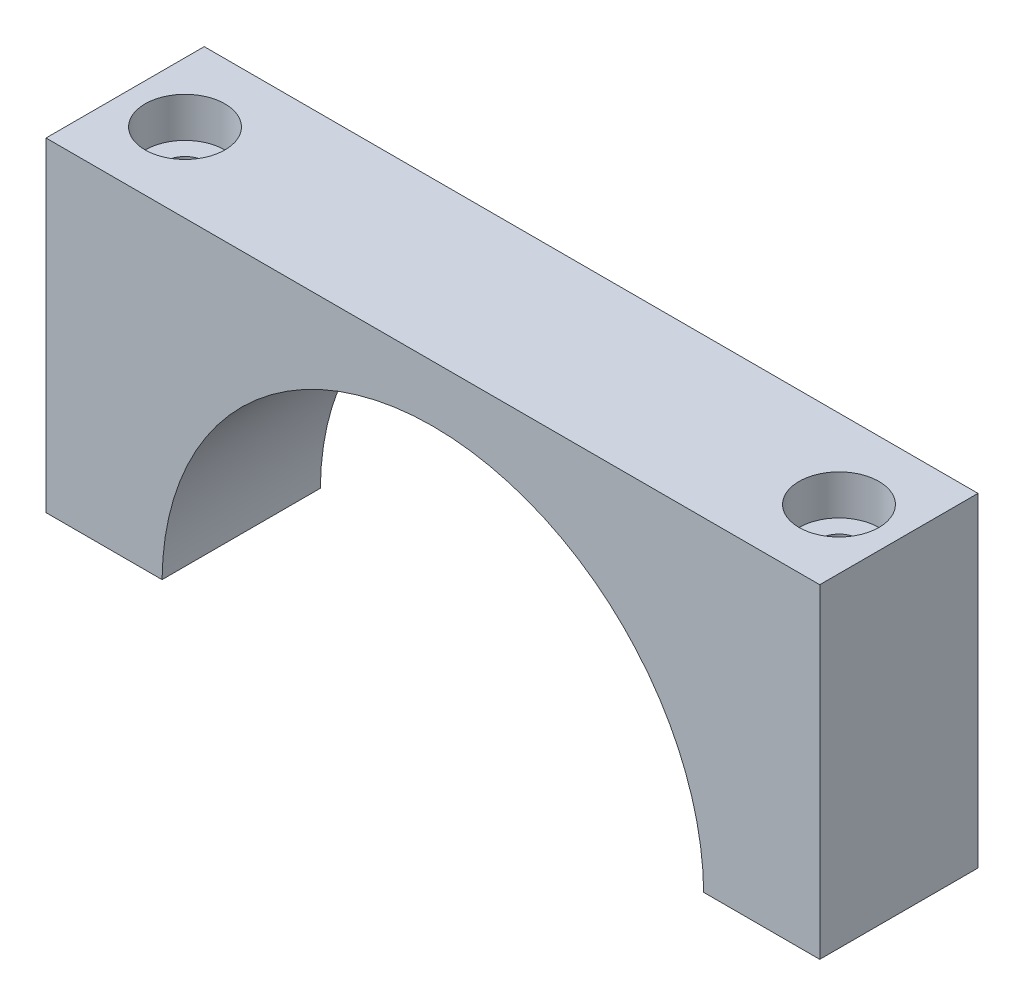
ISO-10303-21;
HEADER;
FILE_DESCRIPTION(('STEP AP214'),'2;1');
FILE_NAME('part.step','',(''),(''),'','','');
FILE_SCHEMA(('AUTOMOTIVE_DESIGN { 1 0 10303 214 1 1 1 1 }'));
ENDSEC;
DATA;
#1=APPLICATION_CONTEXT('core data for automotive mechanical design processes');
#2=APPLICATION_PROTOCOL_DEFINITION('international standard','automotive_design',2000,#1);
#3=PRODUCT_CONTEXT('',#1,'mechanical');
#4=PRODUCT('Part','Part','',(#3));
#5=PRODUCT_RELATED_PRODUCT_CATEGORY('part','',(#4));
#6=PRODUCT_DEFINITION_FORMATION('','',#4);
#7=PRODUCT_DEFINITION_CONTEXT('part definition',#1,'design');
#8=PRODUCT_DEFINITION('design','',#6,#7);
#9=PRODUCT_DEFINITION_SHAPE('','',#8);
#10=(LENGTH_UNIT() NAMED_UNIT(*) SI_UNIT(.MILLI.,.METRE.));
#11=(NAMED_UNIT(*) PLANE_ANGLE_UNIT() SI_UNIT($,.RADIAN.));
#12=(NAMED_UNIT(*) SI_UNIT($,.STERADIAN.) SOLID_ANGLE_UNIT());
#13=UNCERTAINTY_MEASURE_WITH_UNIT(LENGTH_MEASURE(1.E-05),#10,'distance_accuracy_value','');
#14=(GEOMETRIC_REPRESENTATION_CONTEXT(3) GLOBAL_UNCERTAINTY_ASSIGNED_CONTEXT((#13)) GLOBAL_UNIT_ASSIGNED_CONTEXT((#10,
#11,#12)) REPRESENTATION_CONTEXT('',''));
#15=CARTESIAN_POINT('',(0.,0.,0.));
#16=DIRECTION('',(0.,0.,1.));
#17=DIRECTION('',(1.,0.,0.));
#18=AXIS2_PLACEMENT_3D('',#15,#16,#17);
#19=CARTESIAN_POINT('',(0.,41.1711599490778,0.));
#20=DIRECTION('',(0.,0.,1.));
#21=DIRECTION('',(1.,0.,0.));
#22=AXIS2_PLACEMENT_3D('',#19,#20,#21);
#23=PLANE('',#22);
#24=CARTESIAN_POINT('',(0.,0.,0.));
#25=DIRECTION('',(0.,0.,-1.));
#26=DIRECTION('',(-0.999957526333654,-0.0092165898617512,0.));
#27=AXIS2_PLACEMENT_3D('',#24,#25,#26);
#28=CIRCLE('',#27,54.25);
#29=CARTESIAN_POINT('',(-54.2476958036007,0.5,0.));
#30=VERTEX_POINT('',#29);
#31=CARTESIAN_POINT('',(54.2476958036007,0.5,0.));
#32=VERTEX_POINT('',#31);
#33=EDGE_CURVE('E28',#30,#32,#28,.T.);
#34=ORIENTED_EDGE('',*,*,#33,.F.);
#35=DIRECTION('',(1.,0.,0.));
#36=VECTOR('',#35,1.);
#37=CARTESIAN_POINT('',(-77.5,0.5,0.));
#38=LINE('',#37,#36);
#39=CARTESIAN_POINT('',(-77.5,0.5,0.));
#40=VERTEX_POINT('',#39);
#41=EDGE_CURVE('E165',#40,#30,#38,.T.);
#42=ORIENTED_EDGE('',*,*,#41,.F.);
#43=DIRECTION('',(0.,-1.,0.));
#44=VECTOR('',#43,1.);
#45=CARTESIAN_POINT('',(-77.5,65.5,0.));
#46=LINE('',#45,#44);
#47=CARTESIAN_POINT('',(-77.5,65.5,0.));
#48=VERTEX_POINT('',#47);
#49=EDGE_CURVE('E170',#48,#40,#46,.T.);
#50=ORIENTED_EDGE('',*,*,#49,.F.);
#51=DIRECTION('',(-1.,0.,0.));
#52=VECTOR('',#51,1.);
#53=CARTESIAN_POINT('',(77.5,65.5,0.));
#54=LINE('',#53,#52);
#55=CARTESIAN_POINT('',(77.5,65.5,0.));
#56=VERTEX_POINT('',#55);
#57=EDGE_CURVE('E116',#56,#48,#54,.T.);
#58=ORIENTED_EDGE('',*,*,#57,.F.);
#59=DIRECTION('',(0.,1.,0.));
#60=VECTOR('',#59,1.);
#61=CARTESIAN_POINT('',(77.5,0.5,0.));
#62=LINE('',#61,#60);
#63=CARTESIAN_POINT('',(77.5,0.5,0.));
#64=VERTEX_POINT('',#63);
#65=EDGE_CURVE('E108',#64,#56,#62,.T.);
#66=ORIENTED_EDGE('',*,*,#65,.F.);
#67=DIRECTION('',(1.,0.,0.));
#68=VECTOR('',#67,1.);
#69=CARTESIAN_POINT('',(54.2476958036007,0.5,0.));
#70=LINE('',#69,#68);
#71=EDGE_CURVE('E92',#32,#64,#70,.T.);
#72=ORIENTED_EDGE('',*,*,#71,.F.);
#73=EDGE_LOOP('',(#34,#42,#50,#58,#66,#72));
#74=FACE_BOUND('',#73,.T.);
#75=ADVANCED_FACE('F17',(#74),#23,.F.);
#76=CARTESIAN_POINT('',(0.,41.1711599490778,31.7));
#77=DIRECTION('',(0.,0.,1.));
#78=DIRECTION('',(1.,0.,0.));
#79=AXIS2_PLACEMENT_3D('',#76,#77,#78);
#80=PLANE('',#79);
#81=CARTESIAN_POINT('',(0.,0.,31.7));
#82=DIRECTION('',(0.,0.,-1.));
#83=DIRECTION('',(-0.999957526333654,-0.0092165898617512,0.));
#84=AXIS2_PLACEMENT_3D('',#81,#82,#83);
#85=CIRCLE('',#84,54.25);
#86=CARTESIAN_POINT('',(-54.2476958036007,0.5,31.7));
#87=VERTEX_POINT('',#86);
#88=CARTESIAN_POINT('',(54.2476958036007,0.5,31.7));
#89=VERTEX_POINT('',#88);
#90=EDGE_CURVE('E11',#87,#89,#85,.T.);
#91=ORIENTED_EDGE('',*,*,#90,.T.);
#92=DIRECTION('',(1.,0.,0.));
#93=VECTOR('',#92,1.);
#94=CARTESIAN_POINT('',(54.2476958036007,0.5,31.7));
#95=LINE('',#94,#93);
#96=CARTESIAN_POINT('',(77.5,0.5,31.7));
#97=VERTEX_POINT('',#96);
#98=EDGE_CURVE('E102',#89,#97,#95,.T.);
#99=ORIENTED_EDGE('',*,*,#98,.T.);
#100=DIRECTION('',(0.,1.,0.));
#101=VECTOR('',#100,1.);
#102=CARTESIAN_POINT('',(77.5,0.5,31.7));
#103=LINE('',#102,#101);
#104=CARTESIAN_POINT('',(77.5,65.5,31.7));
#105=VERTEX_POINT('',#104);
#106=EDGE_CURVE('E110',#97,#105,#103,.T.);
#107=ORIENTED_EDGE('',*,*,#106,.T.);
#108=DIRECTION('',(-1.,0.,0.));
#109=VECTOR('',#108,1.);
#110=CARTESIAN_POINT('',(77.5,65.5,31.7));
#111=LINE('',#110,#109);
#112=CARTESIAN_POINT('',(-77.5,65.5,31.7));
#113=VERTEX_POINT('',#112);
#114=EDGE_CURVE('E126',#105,#113,#111,.T.);
#115=ORIENTED_EDGE('',*,*,#114,.T.);
#116=DIRECTION('',(0.,-1.,0.));
#117=VECTOR('',#116,1.);
#118=CARTESIAN_POINT('',(-77.5,65.5,31.7));
#119=LINE('',#118,#117);
#120=CARTESIAN_POINT('',(-77.5,0.5,31.7));
#121=VERTEX_POINT('',#120);
#122=EDGE_CURVE('E166',#113,#121,#119,.T.);
#123=ORIENTED_EDGE('',*,*,#122,.T.);
#124=DIRECTION('',(1.,0.,0.));
#125=VECTOR('',#124,1.);
#126=CARTESIAN_POINT('',(-77.5,0.5,31.7));
#127=LINE('',#126,#125);
#128=EDGE_CURVE('E129',#121,#87,#127,.T.);
#129=ORIENTED_EDGE('',*,*,#128,.T.);
#130=EDGE_LOOP('',(#91,#99,#107,#115,#123,#129));
#131=FACE_BOUND('',#130,.T.);
#132=ADVANCED_FACE('F237',(#131),#80,.T.);
#133=CARTESIAN_POINT('',(0.,0.,0.));
#134=DIRECTION('',(0.,0.,1.));
#135=DIRECTION('',(-0.999957526333654,-0.0092165898617512,0.));
#136=AXIS2_PLACEMENT_3D('',#133,#134,#135);
#137=CYLINDRICAL_SURFACE('',#136,54.25);
#138=ORIENTED_EDGE('',*,*,#33,.T.);
#139=DIRECTION('',(0.,0.,1.));
#140=VECTOR('',#139,1.);
#141=CARTESIAN_POINT('',(54.2476958036007,0.5,0.));
#142=LINE('',#141,#140);
#143=EDGE_CURVE('E98',#32,#89,#142,.T.);
#144=ORIENTED_EDGE('',*,*,#143,.T.);
#145=ORIENTED_EDGE('',*,*,#90,.F.);
#146=DIRECTION('',(0.,0.,1.));
#147=VECTOR('',#146,1.);
#148=CARTESIAN_POINT('',(-54.2476958036007,0.5,0.));
#149=LINE('',#148,#147);
#150=EDGE_CURVE('E161',#30,#87,#149,.T.);
#151=ORIENTED_EDGE('',*,*,#150,.F.);
#152=EDGE_LOOP('',(#138,#144,#145,#151));
#153=FACE_BOUND('',#152,.T.);
#154=ADVANCED_FACE('F204',(#153),#137,.F.);
#155=CARTESIAN_POINT('',(54.2476958036007,0.5,0.));
#156=DIRECTION('',(0.,-1.,0.));
#157=DIRECTION('',(-1.,0.,0.));
#158=AXIS2_PLACEMENT_3D('',#155,#156,#157);
#159=PLANE('',#158);
#160=CARTESIAN_POINT('',(65.5,0.500000000000007,15.85));
#161=DIRECTION('',(0.,1.,0.));
#162=DIRECTION('',(-1.,0.,0.));
#163=AXIS2_PLACEMENT_3D('',#160,#161,#162);
#164=CIRCLE('',#163,4.05);
#165=CARTESIAN_POINT('',(69.55,0.500000000000007,15.85));
#166=VERTEX_POINT('',#165);
#167=EDGE_CURVE('E21',#166,#166,#164,.T.);
#168=ORIENTED_EDGE('',*,*,#167,.T.);
#169=EDGE_LOOP('',(#168));
#170=FACE_BOUND('',#169,.T.);
#171=ORIENTED_EDGE('',*,*,#71,.T.);
#172=DIRECTION('',(0.,0.,1.));
#173=VECTOR('',#172,1.);
#174=CARTESIAN_POINT('',(77.5,0.5,0.));
#175=LINE('',#174,#173);
#176=EDGE_CURVE('E96',#64,#97,#175,.T.);
#177=ORIENTED_EDGE('',*,*,#176,.T.);
#178=ORIENTED_EDGE('',*,*,#98,.F.);
#179=ORIENTED_EDGE('',*,*,#143,.F.);
#180=EDGE_LOOP('',(#171,#177,#178,#179));
#181=FACE_BOUND('',#180,.T.);
#182=ADVANCED_FACE('F94',(#170,#181),#159,.T.);
#183=CARTESIAN_POINT('',(77.5,0.5,0.));
#184=DIRECTION('',(1.,0.,0.));
#185=DIRECTION('',(0.,-1.,0.));
#186=AXIS2_PLACEMENT_3D('',#183,#184,#185);
#187=PLANE('',#186);
#188=ORIENTED_EDGE('',*,*,#65,.T.);
#189=DIRECTION('',(0.,0.,1.));
#190=VECTOR('',#189,1.);
#191=CARTESIAN_POINT('',(77.5,65.5,0.));
#192=LINE('',#191,#190);
#193=EDGE_CURVE('E118',#56,#105,#192,.T.);
#194=ORIENTED_EDGE('',*,*,#193,.T.);
#195=ORIENTED_EDGE('',*,*,#106,.F.);
#196=ORIENTED_EDGE('',*,*,#176,.F.);
#197=EDGE_LOOP('',(#188,#194,#195,#196));
#198=FACE_BOUND('',#197,.T.);
#199=ADVANCED_FACE('F106',(#198),#187,.T.);
#200=CARTESIAN_POINT('',(77.5,65.5,0.));
#201=DIRECTION('',(0.,1.,0.));
#202=DIRECTION('',(1.,0.,0.));
#203=AXIS2_PLACEMENT_3D('',#200,#201,#202);
#204=PLANE('',#203);
#205=CARTESIAN_POINT('',(-65.5,65.5,15.85));
#206=DIRECTION('',(0.,-1.,0.));
#207=DIRECTION('',(1.,0.,0.));
#208=AXIS2_PLACEMENT_3D('',#205,#206,#207);
#209=CIRCLE('',#208,8.);
#210=CARTESIAN_POINT('',(-73.5,65.5,15.85));
#211=VERTEX_POINT('',#210);
#212=EDGE_CURVE('E144',#211,#211,#209,.T.);
#213=ORIENTED_EDGE('',*,*,#212,.T.);
#214=EDGE_LOOP('',(#213));
#215=FACE_BOUND('',#214,.T.);
#216=CARTESIAN_POINT('',(65.5,65.5,15.85));
#217=DIRECTION('',(0.,-1.,0.));
#218=DIRECTION('',(-1.,0.,0.));
#219=AXIS2_PLACEMENT_3D('',#216,#217,#218);
#220=CIRCLE('',#219,8.);
#221=CARTESIAN_POINT('',(73.5,65.5,15.85));
#222=VERTEX_POINT('',#221);
#223=EDGE_CURVE('E152',#222,#222,#220,.T.);
#224=ORIENTED_EDGE('',*,*,#223,.T.);
#225=EDGE_LOOP('',(#224));
#226=FACE_BOUND('',#225,.T.);
#227=ORIENTED_EDGE('',*,*,#57,.T.);
#228=DIRECTION('',(0.,0.,1.));
#229=VECTOR('',#228,1.);
#230=CARTESIAN_POINT('',(-77.5,65.5,0.));
#231=LINE('',#230,#229);
#232=EDGE_CURVE('E169',#48,#113,#231,.T.);
#233=ORIENTED_EDGE('',*,*,#232,.T.);
#234=ORIENTED_EDGE('',*,*,#114,.F.);
#235=ORIENTED_EDGE('',*,*,#193,.F.);
#236=EDGE_LOOP('',(#227,#233,#234,#235));
#237=FACE_BOUND('',#236,.T.);
#238=ADVANCED_FACE('F19',(#215,#226,#237),#204,.T.);
#239=CARTESIAN_POINT('',(-77.5,65.5,0.));
#240=DIRECTION('',(-1.,0.,0.));
#241=DIRECTION('',(0.,1.,0.));
#242=AXIS2_PLACEMENT_3D('',#239,#240,#241);
#243=PLANE('',#242);
#244=ORIENTED_EDGE('',*,*,#49,.T.);
#245=DIRECTION('',(0.,0.,1.));
#246=VECTOR('',#245,1.);
#247=CARTESIAN_POINT('',(-77.5,0.5,0.));
#248=LINE('',#247,#246);
#249=EDGE_CURVE('E181',#40,#121,#248,.T.);
#250=ORIENTED_EDGE('',*,*,#249,.T.);
#251=ORIENTED_EDGE('',*,*,#122,.F.);
#252=ORIENTED_EDGE('',*,*,#232,.F.);
#253=EDGE_LOOP('',(#244,#250,#251,#252));
#254=FACE_BOUND('',#253,.T.);
#255=ADVANCED_FACE('F212',(#254),#243,.T.);
#256=CARTESIAN_POINT('',(-77.5,0.5,0.));
#257=DIRECTION('',(0.,-1.,0.));
#258=DIRECTION('',(0.,0.,-1.));
#259=AXIS2_PLACEMENT_3D('',#256,#257,#258);
#260=PLANE('',#259);
#261=CARTESIAN_POINT('',(-65.5,0.500000000000007,15.85));
#262=DIRECTION('',(0.,1.,0.));
#263=DIRECTION('',(1.,0.,0.));
#264=AXIS2_PLACEMENT_3D('',#261,#262,#263);
#265=CIRCLE('',#264,4.05);
#266=CARTESIAN_POINT('',(-69.55,0.500000000000007,15.85));
#267=VERTEX_POINT('',#266);
#268=EDGE_CURVE('E160',#267,#267,#265,.T.);
#269=ORIENTED_EDGE('',*,*,#268,.T.);
#270=EDGE_LOOP('',(#269));
#271=FACE_BOUND('',#270,.T.);
#272=ORIENTED_EDGE('',*,*,#41,.T.);
#273=ORIENTED_EDGE('',*,*,#150,.T.);
#274=ORIENTED_EDGE('',*,*,#128,.F.);
#275=ORIENTED_EDGE('',*,*,#249,.F.);
#276=EDGE_LOOP('',(#272,#273,#274,#275));
#277=FACE_BOUND('',#276,.T.);
#278=ADVANCED_FACE('F208',(#271,#277),#260,.T.);
#279=CARTESIAN_POINT('',(-65.5,-105.540609213134,15.85));
#280=DIRECTION('',(0.,1.,0.));
#281=DIRECTION('',(1.,0.,0.));
#282=AXIS2_PLACEMENT_3D('',#279,#280,#281);
#283=CYLINDRICAL_SURFACE('',#282,4.05);
#284=CARTESIAN_POINT('',(-65.5,57.5,15.85));
#285=DIRECTION('',(0.,1.,0.));
#286=DIRECTION('',(1.,0.,0.));
#287=AXIS2_PLACEMENT_3D('',#284,#285,#286);
#288=CIRCLE('',#287,4.05);
#289=CARTESIAN_POINT('',(-69.55,57.5,15.85));
#290=VERTEX_POINT('',#289);
#291=EDGE_CURVE('E137',#290,#290,#288,.T.);
#292=ORIENTED_EDGE('',*,*,#291,.T.);
#293=DIRECTION('',(0.,-1.,0.));
#294=VECTOR('',#293,1.);
#295=CARTESIAN_POINT('',(-69.55,-105.540609213134,15.85));
#296=LINE('',#295,#294);
#297=EDGE_CURVE('E143',#290,#267,#296,.T.);
#298=ORIENTED_EDGE('',*,*,#297,.T.);
#299=ORIENTED_EDGE('',*,*,#268,.F.);
#300=ORIENTED_EDGE('',*,*,#297,.F.);
#301=EDGE_LOOP('',(#292,#298,#299,#300));
#302=FACE_BOUND('',#301,.T.);
#303=ADVANCED_FACE('F368',(#302),#283,.F.);
#304=CARTESIAN_POINT('',(-65.5,61.5,15.85));
#305=DIRECTION('',(0.,1.,0.));
#306=DIRECTION('',(1.,0.,0.));
#307=AXIS2_PLACEMENT_3D('',#304,#305,#306);
#308=CYLINDRICAL_SURFACE('',#307,8.);
#309=ORIENTED_EDGE('',*,*,#212,.F.);
#310=DIRECTION('',(0.,-1.,0.));
#311=VECTOR('',#310,1.);
#312=CARTESIAN_POINT('',(-73.5,61.5,15.85));
#313=LINE('',#312,#311);
#314=CARTESIAN_POINT('',(-73.5,57.5,15.85));
#315=VERTEX_POINT('',#314);
#316=EDGE_CURVE('E139',#211,#315,#313,.T.);
#317=ORIENTED_EDGE('',*,*,#316,.T.);
#318=CARTESIAN_POINT('',(-65.5,57.5,15.85));
#319=DIRECTION('',(0.,1.,0.));
#320=DIRECTION('',(1.,0.,0.));
#321=AXIS2_PLACEMENT_3D('',#318,#319,#320);
#322=CIRCLE('',#321,8.);
#323=EDGE_CURVE('E134',#315,#315,#322,.T.);
#324=ORIENTED_EDGE('',*,*,#323,.F.);
#325=ORIENTED_EDGE('',*,*,#316,.F.);
#326=EDGE_LOOP('',(#309,#317,#324,#325));
#327=FACE_BOUND('',#326,.T.);
#328=ADVANCED_FACE('F360',(#327),#308,.F.);
#329=CARTESIAN_POINT('',(-65.5,57.5,15.85));
#330=DIRECTION('',(0.,1.,0.));
#331=DIRECTION('',(1.,0.,0.));
#332=AXIS2_PLACEMENT_3D('',#329,#330,#331);
#333=PLANE('',#332);
#334=ORIENTED_EDGE('',*,*,#291,.F.);
#335=EDGE_LOOP('',(#334));
#336=FACE_BOUND('',#335,.T.);
#337=ORIENTED_EDGE('',*,*,#323,.T.);
#338=EDGE_LOOP('',(#337));
#339=FACE_BOUND('',#338,.T.);
#340=ADVANCED_FACE('F358',(#336,#339),#333,.T.);
#341=CARTESIAN_POINT('',(65.5,-105.540609213134,15.85));
#342=DIRECTION('',(0.,-1.,0.));
#343=DIRECTION('',(-1.,0.,0.));
#344=AXIS2_PLACEMENT_3D('',#341,#342,#343);
#345=CYLINDRICAL_SURFACE('',#344,4.05);
#346=CARTESIAN_POINT('',(65.5,57.5,15.85));
#347=DIRECTION('',(0.,-1.,0.));
#348=DIRECTION('',(-1.,0.,0.));
#349=AXIS2_PLACEMENT_3D('',#346,#347,#348);
#350=CIRCLE('',#349,4.05);
#351=CARTESIAN_POINT('',(69.55,57.5,15.85));
#352=VERTEX_POINT('',#351);
#353=EDGE_CURVE('E156',#352,#352,#350,.T.);
#354=ORIENTED_EDGE('',*,*,#353,.F.);
#355=DIRECTION('',(0.,-1.,0.));
#356=VECTOR('',#355,1.);
#357=CARTESIAN_POINT('',(69.55,-105.540609213134,15.85));
#358=LINE('',#357,#356);
#359=EDGE_CURVE('E147',#352,#166,#358,.T.);
#360=ORIENTED_EDGE('',*,*,#359,.T.);
#361=ORIENTED_EDGE('',*,*,#167,.F.);
#362=ORIENTED_EDGE('',*,*,#359,.F.);
#363=EDGE_LOOP('',(#354,#360,#361,#362));
#364=FACE_BOUND('',#363,.T.);
#365=ADVANCED_FACE('F357',(#364),#345,.F.);
#366=CARTESIAN_POINT('',(65.5,61.5,15.85));
#367=DIRECTION('',(0.,-1.,0.));
#368=DIRECTION('',(-1.,0.,0.));
#369=AXIS2_PLACEMENT_3D('',#366,#367,#368);
#370=CYLINDRICAL_SURFACE('',#369,8.);
#371=ORIENTED_EDGE('',*,*,#223,.F.);
#372=DIRECTION('',(0.,-1.,0.));
#373=VECTOR('',#372,1.);
#374=CARTESIAN_POINT('',(73.5,61.5,15.85));
#375=LINE('',#374,#373);
#376=CARTESIAN_POINT('',(73.5,57.5,15.85));
#377=VERTEX_POINT('',#376);
#378=EDGE_CURVE('E151',#222,#377,#375,.T.);
#379=ORIENTED_EDGE('',*,*,#378,.T.);
#380=CARTESIAN_POINT('',(65.5,57.5,15.85));
#381=DIRECTION('',(0.,-1.,0.));
#382=DIRECTION('',(-1.,0.,0.));
#383=AXIS2_PLACEMENT_3D('',#380,#381,#382);
#384=CIRCLE('',#383,8.);
#385=EDGE_CURVE('E188',#377,#377,#384,.T.);
#386=ORIENTED_EDGE('',*,*,#385,.T.);
#387=ORIENTED_EDGE('',*,*,#378,.F.);
#388=EDGE_LOOP('',(#371,#379,#386,#387));
#389=FACE_BOUND('',#388,.T.);
#390=ADVANCED_FACE('F334',(#389),#370,.F.);
#391=CARTESIAN_POINT('',(65.5,57.5,15.85));
#392=DIRECTION('',(0.,-1.,0.));
#393=DIRECTION('',(0.,0.,-1.));
#394=AXIS2_PLACEMENT_3D('',#391,#392,#393);
#395=PLANE('',#394);
#396=ORIENTED_EDGE('',*,*,#353,.T.);
#397=EDGE_LOOP('',(#396));
#398=FACE_BOUND('',#397,.T.);
#399=ORIENTED_EDGE('',*,*,#385,.F.);
#400=EDGE_LOOP('',(#399));
#401=FACE_BOUND('',#400,.T.);
#402=ADVANCED_FACE('F356',(#398,#401),#395,.F.);
#403=CLOSED_SHELL('',(#75,#132,#154,#182,#199,#238,#255,#278,#303,#328,#340,#365,#390,#402));
#404=MANIFOLD_SOLID_BREP('B1',#403);
#405=ADVANCED_BREP_SHAPE_REPRESENTATION('',(#18,#404),#14);
#406=SHAPE_DEFINITION_REPRESENTATION(#9,#405);
ENDSEC;
END-ISO-10303-21;
